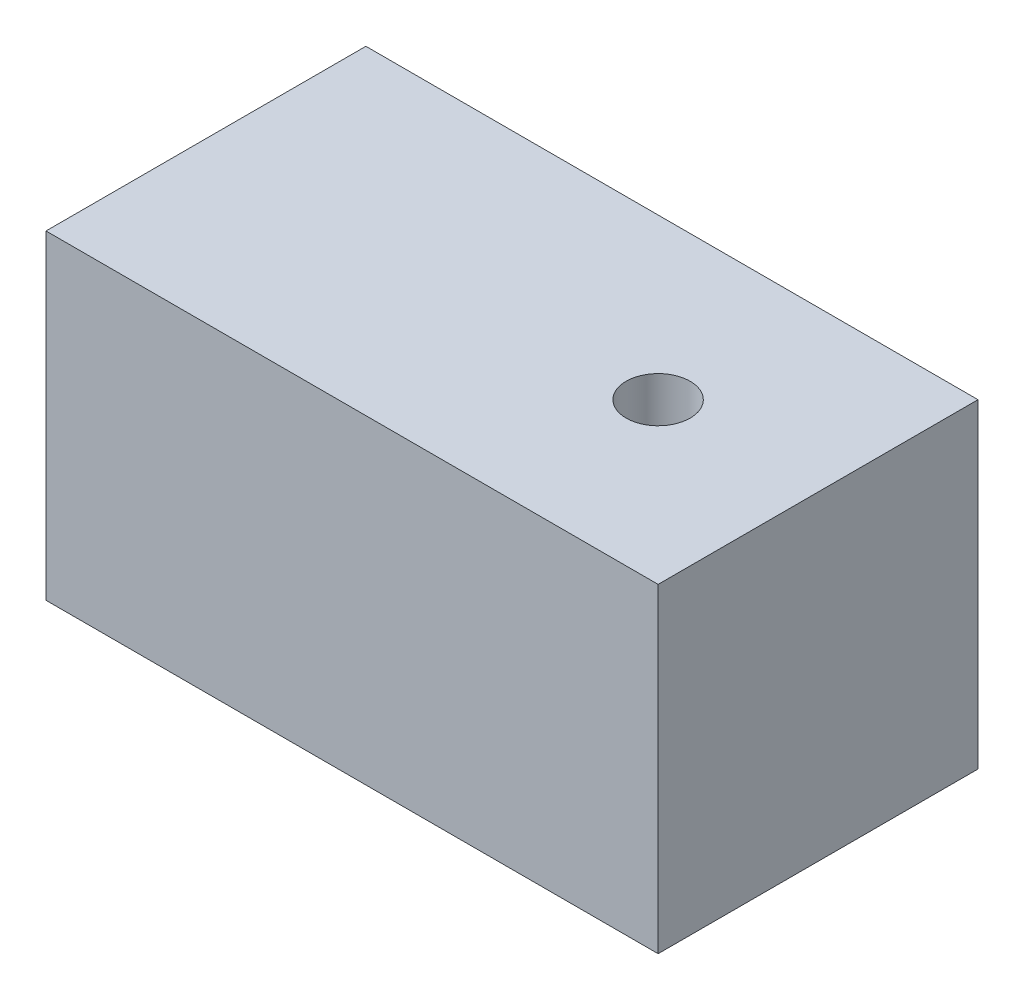
ISO-10303-21;
HEADER;
FILE_DESCRIPTION(('STEP AP214'),'2;1');
FILE_NAME('part.step','',(''),(''),'','','');
FILE_SCHEMA(('AUTOMOTIVE_DESIGN { 1 0 10303 214 1 1 1 1 }'));
ENDSEC;
DATA;
#1=APPLICATION_CONTEXT('core data for automotive mechanical design processes');
#2=APPLICATION_PROTOCOL_DEFINITION('international standard','automotive_design',2000,#1);
#3=PRODUCT_CONTEXT('',#1,'mechanical');
#4=PRODUCT('Part','Part','',(#3));
#5=PRODUCT_RELATED_PRODUCT_CATEGORY('part','',(#4));
#6=PRODUCT_DEFINITION_FORMATION('','',#4);
#7=PRODUCT_DEFINITION_CONTEXT('part definition',#1,'design');
#8=PRODUCT_DEFINITION('design','',#6,#7);
#9=PRODUCT_DEFINITION_SHAPE('','',#8);
#10=(LENGTH_UNIT() NAMED_UNIT(*) SI_UNIT(.MILLI.,.METRE.));
#11=(NAMED_UNIT(*) PLANE_ANGLE_UNIT() SI_UNIT($,.RADIAN.));
#12=(NAMED_UNIT(*) SI_UNIT($,.STERADIAN.) SOLID_ANGLE_UNIT());
#13=UNCERTAINTY_MEASURE_WITH_UNIT(LENGTH_MEASURE(1.E-05),#10,'distance_accuracy_value','');
#14=(GEOMETRIC_REPRESENTATION_CONTEXT(3) GLOBAL_UNCERTAINTY_ASSIGNED_CONTEXT((#13)) GLOBAL_UNIT_ASSIGNED_CONTEXT((#10,
#11,#12)) REPRESENTATION_CONTEXT('',''));
#15=CARTESIAN_POINT('',(0.,0.,0.));
#16=DIRECTION('',(0.,0.,1.));
#17=DIRECTION('',(1.,0.,0.));
#18=AXIS2_PLACEMENT_3D('',#15,#16,#17);
#19=CARTESIAN_POINT('',(0.,12.7,-12.7));
#20=DIRECTION('',(0.,-1.,0.));
#21=DIRECTION('',(0.,0.,-1.));
#22=AXIS2_PLACEMENT_3D('',#19,#20,#21);
#23=PLANE('',#22);
#24=DIRECTION('',(0.,0.,1.));
#25=VECTOR('',#24,1.);
#26=CARTESIAN_POINT('',(0.,12.7,0.));
#27=LINE('',#26,#25);
#28=CARTESIAN_POINT('',(0.,12.7,-12.7));
#29=VERTEX_POINT('',#28);
#30=CARTESIAN_POINT('',(0.,12.7,0.));
#31=VERTEX_POINT('',#30);
#32=EDGE_CURVE('E87',#29,#31,#27,.T.);
#33=ORIENTED_EDGE('',*,*,#32,.T.);
#34=DIRECTION('',(1.,0.,0.));
#35=VECTOR('',#34,1.);
#36=CARTESIAN_POINT('',(0.,12.7,0.));
#37=LINE('',#36,#35);
#38=CARTESIAN_POINT('',(24.3031553392257,12.7,0.));
#39=VERTEX_POINT('',#38);
#40=EDGE_CURVE('E82',#31,#39,#37,.T.);
#41=ORIENTED_EDGE('',*,*,#40,.T.);
#42=DIRECTION('',(0.,0.,-1.));
#43=VECTOR('',#42,1.);
#44=CARTESIAN_POINT('',(24.3031553392257,12.7,0.));
#45=LINE('',#44,#43);
#46=CARTESIAN_POINT('',(24.3031553392257,12.7,-12.7));
#47=VERTEX_POINT('',#46);
#48=EDGE_CURVE('E85',#39,#47,#45,.T.);
#49=ORIENTED_EDGE('',*,*,#48,.T.);
#50=DIRECTION('',(-1.,0.,0.));
#51=VECTOR('',#50,1.);
#52=CARTESIAN_POINT('',(0.,12.7,-12.7));
#53=LINE('',#52,#51);
#54=EDGE_CURVE('E52',#47,#29,#53,.T.);
#55=ORIENTED_EDGE('',*,*,#54,.T.);
#56=EDGE_LOOP('',(#33,#41,#49,#55));
#57=FACE_BOUND('',#56,.T.);
#58=CARTESIAN_POINT('',(17.9531553392258,12.7,-6.35));
#59=DIRECTION('',(0.,1.,0.));
#60=DIRECTION('',(0.,0.,1.));
#61=AXIS2_PLACEMENT_3D('',#58,#59,#60);
#62=CIRCLE('',#61,1.27);
#63=CARTESIAN_POINT('',(17.9531553392258,12.7,-5.08));
#64=VERTEX_POINT('',#63);
#65=EDGE_CURVE('E117',#64,#64,#62,.T.);
#66=ORIENTED_EDGE('',*,*,#65,.F.);
#67=EDGE_LOOP('',(#66));
#68=FACE_BOUND('',#67,.T.);
#69=ADVANCED_FACE('F35',(#57,#68),#23,.F.);
#70=CARTESIAN_POINT('',(0.,0.,-12.7));
#71=DIRECTION('',(0.,-1.,0.));
#72=DIRECTION('',(0.,0.,-1.));
#73=AXIS2_PLACEMENT_3D('',#70,#71,#72);
#74=PLANE('',#73);
#75=DIRECTION('',(0.,0.,1.));
#76=VECTOR('',#75,1.);
#77=CARTESIAN_POINT('',(0.,0.,0.));
#78=LINE('',#77,#76);
#79=CARTESIAN_POINT('',(0.,0.,-12.7));
#80=VERTEX_POINT('',#79);
#81=CARTESIAN_POINT('',(0.,0.,0.));
#82=VERTEX_POINT('',#81);
#83=EDGE_CURVE('E99',#80,#82,#78,.T.);
#84=ORIENTED_EDGE('',*,*,#83,.F.);
#85=DIRECTION('',(-1.,0.,0.));
#86=VECTOR('',#85,1.);
#87=CARTESIAN_POINT('',(0.,0.,-12.7));
#88=LINE('',#87,#86);
#89=CARTESIAN_POINT('',(24.3031553392257,0.,-12.7));
#90=VERTEX_POINT('',#89);
#91=EDGE_CURVE('E75',#90,#80,#88,.T.);
#92=ORIENTED_EDGE('',*,*,#91,.F.);
#93=DIRECTION('',(0.,0.,-1.));
#94=VECTOR('',#93,1.);
#95=CARTESIAN_POINT('',(24.3031553392257,0.,0.));
#96=LINE('',#95,#94);
#97=CARTESIAN_POINT('',(24.3031553392257,0.,0.));
#98=VERTEX_POINT('',#97);
#99=EDGE_CURVE('E69',#98,#90,#96,.T.);
#100=ORIENTED_EDGE('',*,*,#99,.F.);
#101=DIRECTION('',(1.,0.,0.));
#102=VECTOR('',#101,1.);
#103=CARTESIAN_POINT('',(0.,0.,0.));
#104=LINE('',#103,#102);
#105=EDGE_CURVE('E91',#82,#98,#104,.T.);
#106=ORIENTED_EDGE('',*,*,#105,.F.);
#107=EDGE_LOOP('',(#84,#92,#100,#106));
#108=FACE_BOUND('',#107,.T.);
#109=CARTESIAN_POINT('',(17.9531553392258,0.,-6.35));
#110=DIRECTION('',(0.,1.,0.));
#111=DIRECTION('',(0.,0.,1.));
#112=AXIS2_PLACEMENT_3D('',#109,#110,#111);
#113=CIRCLE('',#112,1.27);
#114=CARTESIAN_POINT('',(17.9531553392258,0.,-5.08));
#115=VERTEX_POINT('',#114);
#116=EDGE_CURVE('E120',#115,#115,#113,.T.);
#117=ORIENTED_EDGE('',*,*,#116,.T.);
#118=EDGE_LOOP('',(#117));
#119=FACE_BOUND('',#118,.T.);
#120=ADVANCED_FACE('F110',(#108,#119),#74,.T.);
#121=CARTESIAN_POINT('',(0.,12.7,0.));
#122=DIRECTION('',(1.,0.,0.));
#123=DIRECTION('',(0.,0.,-1.));
#124=AXIS2_PLACEMENT_3D('',#121,#122,#123);
#125=PLANE('',#124);
#126=CARTESIAN_POINT('',(0.,6.35,-6.36220119514285));
#127=DIRECTION('',(-1.,0.,0.));
#128=DIRECTION('',(0.,0.,1.));
#129=AXIS2_PLACEMENT_3D('',#126,#127,#128);
#130=CIRCLE('',#129,1.75);
#131=CARTESIAN_POINT('',(0.,6.35,-4.61220119514285));
#132=VERTEX_POINT('',#131);
#133=EDGE_CURVE('E114',#132,#132,#130,.T.);
#134=ORIENTED_EDGE('',*,*,#133,.F.);
#135=EDGE_LOOP('',(#134));
#136=FACE_BOUND('',#135,.T.);
#137=ORIENTED_EDGE('',*,*,#83,.T.);
#138=DIRECTION('',(0.,-1.,0.));
#139=VECTOR('',#138,1.);
#140=CARTESIAN_POINT('',(0.,12.7,0.));
#141=LINE('',#140,#139);
#142=EDGE_CURVE('E11',#31,#82,#141,.T.);
#143=ORIENTED_EDGE('',*,*,#142,.F.);
#144=ORIENTED_EDGE('',*,*,#32,.F.);
#145=DIRECTION('',(0.,-1.,0.));
#146=VECTOR('',#145,1.);
#147=CARTESIAN_POINT('',(0.,12.7,-12.7));
#148=LINE('',#147,#146);
#149=EDGE_CURVE('E95',#29,#80,#148,.T.);
#150=ORIENTED_EDGE('',*,*,#149,.T.);
#151=EDGE_LOOP('',(#137,#143,#144,#150));
#152=FACE_BOUND('',#151,.T.);
#153=ADVANCED_FACE('F37',(#136,#152),#125,.F.);
#154=CARTESIAN_POINT('',(0.,12.7,0.));
#155=DIRECTION('',(0.,0.,-1.));
#156=DIRECTION('',(-1.,0.,0.));
#157=AXIS2_PLACEMENT_3D('',#154,#155,#156);
#158=PLANE('',#157);
#159=ORIENTED_EDGE('',*,*,#105,.T.);
#160=DIRECTION('',(0.,-1.,0.));
#161=VECTOR('',#160,1.);
#162=CARTESIAN_POINT('',(24.3031553392257,12.7,0.));
#163=LINE('',#162,#161);
#164=EDGE_CURVE('E44',#39,#98,#163,.T.);
#165=ORIENTED_EDGE('',*,*,#164,.F.);
#166=ORIENTED_EDGE('',*,*,#40,.F.);
#167=ORIENTED_EDGE('',*,*,#142,.T.);
#168=EDGE_LOOP('',(#159,#165,#166,#167));
#169=FACE_BOUND('',#168,.T.);
#170=ADVANCED_FACE('F90',(#169),#158,.F.);
#171=CARTESIAN_POINT('',(24.3031553392257,12.7,0.));
#172=DIRECTION('',(-1.,0.,0.));
#173=DIRECTION('',(0.,0.,1.));
#174=AXIS2_PLACEMENT_3D('',#171,#172,#173);
#175=PLANE('',#174);
#176=ORIENTED_EDGE('',*,*,#99,.T.);
#177=DIRECTION('',(0.,-1.,0.));
#178=VECTOR('',#177,1.);
#179=CARTESIAN_POINT('',(24.3031553392257,12.7,-12.7));
#180=LINE('',#179,#178);
#181=EDGE_CURVE('E92',#47,#90,#180,.T.);
#182=ORIENTED_EDGE('',*,*,#181,.F.);
#183=ORIENTED_EDGE('',*,*,#48,.F.);
#184=ORIENTED_EDGE('',*,*,#164,.T.);
#185=EDGE_LOOP('',(#176,#182,#183,#184));
#186=FACE_BOUND('',#185,.T.);
#187=ADVANCED_FACE('F93',(#186),#175,.F.);
#188=CARTESIAN_POINT('',(0.,12.7,-12.7));
#189=DIRECTION('',(0.,0.,1.));
#190=DIRECTION('',(1.,0.,0.));
#191=AXIS2_PLACEMENT_3D('',#188,#189,#190);
#192=PLANE('',#191);
#193=ORIENTED_EDGE('',*,*,#91,.T.);
#194=ORIENTED_EDGE('',*,*,#149,.F.);
#195=ORIENTED_EDGE('',*,*,#54,.F.);
#196=ORIENTED_EDGE('',*,*,#181,.T.);
#197=EDGE_LOOP('',(#193,#194,#195,#196));
#198=FACE_BOUND('',#197,.T.);
#199=ADVANCED_FACE('F107',(#198),#192,.F.);
#200=CARTESIAN_POINT('',(14.224,6.35,-6.36220119514285));
#201=DIRECTION('',(-1.,0.,0.));
#202=DIRECTION('',(0.,0.,1.));
#203=AXIS2_PLACEMENT_3D('',#200,#201,#202);
#204=CYLINDRICAL_SURFACE('',#203,1.75);
#205=CARTESIAN_POINT('',(14.224,6.35,-6.36220119514285));
#206=DIRECTION('',(-1.,0.,0.));
#207=DIRECTION('',(0.,0.,1.));
#208=AXIS2_PLACEMENT_3D('',#205,#206,#207);
#209=CIRCLE('',#208,1.75);
#210=CARTESIAN_POINT('',(14.224,6.35,-4.61220119514285));
#211=VERTEX_POINT('',#210);
#212=EDGE_CURVE('E102',#211,#211,#209,.T.);
#213=CARTESIAN_POINT('',(14.224,6.35,-4.61220119514285));
#214=CARTESIAN_POINT('',(14.0758333333333,6.35,-4.61220119514285));
#215=CARTESIAN_POINT('',(13.9276666666667,6.35,-4.61220119514285));
#216=CARTESIAN_POINT('',(13.6313333333333,6.35,-4.61220119514285));
#217=CARTESIAN_POINT('',(13.4831666666667,6.35,-4.61220119514285));
#218=CARTESIAN_POINT('',(13.1868333333333,6.35,-4.61220119514285));
#219=CARTESIAN_POINT('',(13.0386666666667,6.35,-4.61220119514285));
#220=CARTESIAN_POINT('',(12.7423333333333,6.35,-4.61220119514285));
#221=CARTESIAN_POINT('',(12.5941666666667,6.35,-4.61220119514285));
#222=CARTESIAN_POINT('',(12.2978333333333,6.35,-4.61220119514285));
#223=CARTESIAN_POINT('',(12.1496666666667,6.35,-4.61220119514285));
#224=CARTESIAN_POINT('',(11.8533333333333,6.35,-4.61220119514285));
#225=CARTESIAN_POINT('',(11.7051666666667,6.35,-4.61220119514285));
#226=CARTESIAN_POINT('',(11.4088333333333,6.35,-4.61220119514285));
#227=CARTESIAN_POINT('',(11.2606666666667,6.35,-4.61220119514285));
#228=CARTESIAN_POINT('',(10.9643333333333,6.35,-4.61220119514285));
#229=CARTESIAN_POINT('',(10.8161666666667,6.35,-4.61220119514285));
#230=CARTESIAN_POINT('',(10.5198333333333,6.35,-4.61220119514285));
#231=CARTESIAN_POINT('',(10.3716666666667,6.35,-4.61220119514285));
#232=CARTESIAN_POINT('',(10.0753333333333,6.35,-4.61220119514285));
#233=CARTESIAN_POINT('',(9.92716666666666,6.35,-4.61220119514285));
#234=CARTESIAN_POINT('',(9.63083333333333,6.35,-4.61220119514285));
#235=CARTESIAN_POINT('',(9.48266666666666,6.35,-4.61220119514285));
#236=CARTESIAN_POINT('',(9.18633333333333,6.35,-4.61220119514285));
#237=CARTESIAN_POINT('',(9.03816666666666,6.35,-4.61220119514285));
#238=CARTESIAN_POINT('',(8.74183333333333,6.35,-4.61220119514285));
#239=CARTESIAN_POINT('',(8.59366666666666,6.35,-4.61220119514285));
#240=CARTESIAN_POINT('',(8.29733333333333,6.35,-4.61220119514285));
#241=CARTESIAN_POINT('',(8.14916666666666,6.35,-4.61220119514285));
#242=CARTESIAN_POINT('',(7.85283333333333,6.35,-4.61220119514285));
#243=CARTESIAN_POINT('',(7.70466666666666,6.35,-4.61220119514285));
#244=CARTESIAN_POINT('',(7.40833333333333,6.35,-4.61220119514285));
#245=CARTESIAN_POINT('',(7.26016666666666,6.35,-4.61220119514285));
#246=CARTESIAN_POINT('',(6.96383333333333,6.35,-4.61220119514285));
#247=CARTESIAN_POINT('',(6.81566666666666,6.35,-4.61220119514285));
#248=CARTESIAN_POINT('',(6.51933333333333,6.35,-4.61220119514285));
#249=CARTESIAN_POINT('',(6.37116666666666,6.35,-4.61220119514285));
#250=CARTESIAN_POINT('',(6.07483333333333,6.35,-4.61220119514285));
#251=CARTESIAN_POINT('',(5.92666666666666,6.35,-4.61220119514285));
#252=CARTESIAN_POINT('',(5.63033333333333,6.35,-4.61220119514285));
#253=CARTESIAN_POINT('',(5.48216666666667,6.35,-4.61220119514285));
#254=CARTESIAN_POINT('',(5.18583333333333,6.35,-4.61220119514285));
#255=CARTESIAN_POINT('',(5.03766666666667,6.35,-4.61220119514285));
#256=CARTESIAN_POINT('',(4.74133333333333,6.35,-4.61220119514285));
#257=CARTESIAN_POINT('',(4.59316666666667,6.35,-4.61220119514285));
#258=CARTESIAN_POINT('',(4.29683333333333,6.35,-4.61220119514285));
#259=CARTESIAN_POINT('',(4.14866666666667,6.35,-4.61220119514285));
#260=CARTESIAN_POINT('',(3.85233333333333,6.35,-4.61220119514285));
#261=CARTESIAN_POINT('',(3.70416666666667,6.35,-4.61220119514285));
#262=CARTESIAN_POINT('',(3.40783333333333,6.35,-4.61220119514285));
#263=CARTESIAN_POINT('',(3.25966666666667,6.35,-4.61220119514285));
#264=CARTESIAN_POINT('',(2.96333333333333,6.35,-4.61220119514285));
#265=CARTESIAN_POINT('',(2.81516666666667,6.35,-4.61220119514285));
#266=CARTESIAN_POINT('',(2.51883333333333,6.35,-4.61220119514285));
#267=CARTESIAN_POINT('',(2.37066666666667,6.35,-4.61220119514285));
#268=CARTESIAN_POINT('',(2.07433333333333,6.35,-4.61220119514285));
#269=CARTESIAN_POINT('',(1.92616666666667,6.35,-4.61220119514285));
#270=CARTESIAN_POINT('',(1.62983333333333,6.35,-4.61220119514285));
#271=CARTESIAN_POINT('',(1.48166666666667,6.35,-4.61220119514285));
#272=CARTESIAN_POINT('',(1.18533333333333,6.35,-4.61220119514285));
#273=CARTESIAN_POINT('',(1.03716666666667,6.35,-4.61220119514285));
#274=CARTESIAN_POINT('',(0.740833333333335,6.35,-4.61220119514285));
#275=CARTESIAN_POINT('',(0.592666666666668,6.35,-4.61220119514285));
#276=CARTESIAN_POINT('',(0.296333333333335,6.35,-4.61220119514285));
#277=CARTESIAN_POINT('',(0.148166666666669,6.35,-4.61220119514285));
#278=CARTESIAN_POINT('',(0.,6.35,-4.61220119514285));
#279=B_SPLINE_CURVE_WITH_KNOTS('',3,(#213,#214,#215,#216,#217,#218,#219,#220,#221,#222,#223,
#224,#225,#226,#227,#228,#229,#230,#231,#232,#233,#234,#235,#236,#237,#238,#239,#240,#241,#242,
#243,#244,#245,#246,#247,#248,#249,#250,#251,#252,#253,#254,#255,#256,#257,#258,#259,#260,#261,
#262,#263,#264,#265,#266,#267,#268,#269,#270,#271,#272,#273,#274,#275,#276,#277,#278),
.UNSPECIFIED.,.F.,.F.,(4,2,2,2,2,2,2,2,2,2,2,2,2,2,2,2,2,2,2,2,2,2,2,2,2,2,2,2,2,2,2,2,4),(0.,
0.4445,0.889000000000001,1.3335,1.778,2.2225,2.667,3.1115,3.556,4.0005,4.445,4.8895,5.334,
5.7785,6.223,6.6675,7.112,7.5565,8.00099999999999,8.44549999999999,8.88999999999999,
9.33449999999999,9.77899999999999,10.2235,10.668,11.1125,11.557,12.0015,12.446,12.8905,13.335,
13.7795,14.224),.UNSPECIFIED.);
#280=EDGE_CURVE('BSEAM135',#211,#132,#279,.T.);
#281=ORIENTED_EDGE('',*,*,#212,.F.);
#282=ORIENTED_EDGE('',*,*,#133,.T.);
#283=ORIENTED_EDGE('',*,*,#280,.T.);
#284=ORIENTED_EDGE('',*,*,#280,.F.);
#285=EDGE_LOOP('',(#281,#283,#282,#284));
#286=FACE_BOUND('',#285,.T.);
#287=ADVANCED_FACE('F135',(#286),#204,.F.);
#288=CARTESIAN_POINT('',(14.224,6.35,-6.36220119514285));
#289=DIRECTION('',(-1.,0.,0.));
#290=DIRECTION('',(0.,0.,1.));
#291=AXIS2_PLACEMENT_3D('',#288,#289,#290);
#292=PLANE('',#291);
#293=ORIENTED_EDGE('',*,*,#212,.T.);
#294=EDGE_LOOP('',(#293));
#295=FACE_BOUND('',#294,.T.);
#296=ADVANCED_FACE('F151',(#295),#292,.T.);
#297=CARTESIAN_POINT('',(17.9531553392258,12.7,-6.35));
#298=DIRECTION('',(0.,-1.,0.));
#299=DIRECTION('',(0.,0.,-1.));
#300=AXIS2_PLACEMENT_3D('',#297,#298,#299);
#301=CYLINDRICAL_SURFACE('',#300,1.27);
#302=ORIENTED_EDGE('',*,*,#65,.T.);
#303=EDGE_LOOP('',(#302));
#304=FACE_BOUND('',#303,.T.);
#305=ORIENTED_EDGE('',*,*,#116,.F.);
#306=EDGE_LOOP('',(#305));
#307=FACE_BOUND('',#306,.T.);
#308=ADVANCED_FACE('F126',(#304,#307),#301,.F.);
#309=CLOSED_SHELL('',(#69,#120,#153,#170,#187,#199,#287,#296,#308));
#310=MANIFOLD_SOLID_BREP('B2',#309);
#311=ADVANCED_BREP_SHAPE_REPRESENTATION('',(#18,#310),#14);
#312=SHAPE_DEFINITION_REPRESENTATION(#9,#311);
ENDSEC;
END-ISO-10303-21;
